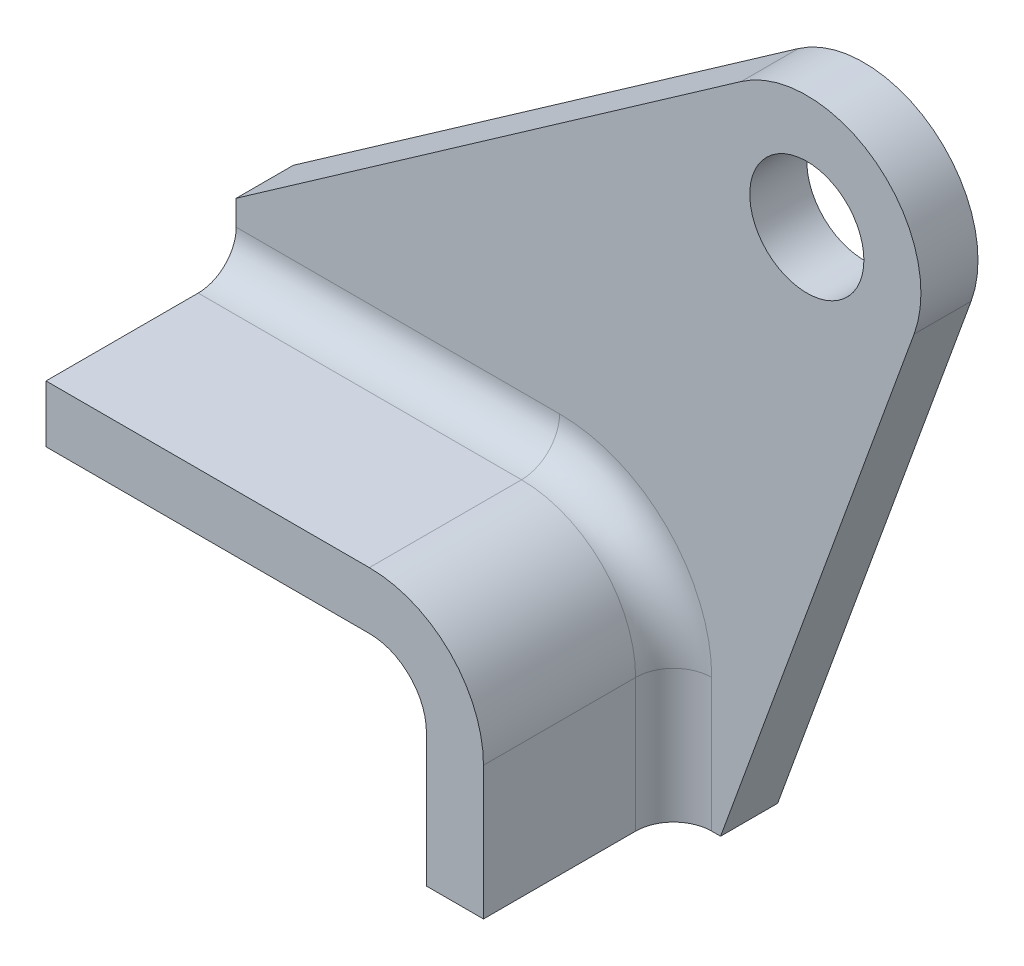
ISO-10303-21;
HEADER;
FILE_DESCRIPTION(('STEP AP214'),'2;1');
FILE_NAME('part.step','',(''),(''),'','','');
FILE_SCHEMA(('AUTOMOTIVE_DESIGN { 1 0 10303 214 1 1 1 1 }'));
ENDSEC;
DATA;
#1=APPLICATION_CONTEXT('core data for automotive mechanical design processes');
#2=APPLICATION_PROTOCOL_DEFINITION('international standard','automotive_design',2000,#1);
#3=PRODUCT_CONTEXT('',#1,'mechanical');
#4=PRODUCT('Part','Part','',(#3));
#5=PRODUCT_RELATED_PRODUCT_CATEGORY('part','',(#4));
#6=PRODUCT_DEFINITION_FORMATION('','',#4);
#7=PRODUCT_DEFINITION_CONTEXT('part definition',#1,'design');
#8=PRODUCT_DEFINITION('design','',#6,#7);
#9=PRODUCT_DEFINITION_SHAPE('','',#8);
#10=(LENGTH_UNIT() NAMED_UNIT(*) SI_UNIT(.MILLI.,.METRE.));
#11=(NAMED_UNIT(*) PLANE_ANGLE_UNIT() SI_UNIT($,.RADIAN.));
#12=(NAMED_UNIT(*) SI_UNIT($,.STERADIAN.) SOLID_ANGLE_UNIT());
#13=UNCERTAINTY_MEASURE_WITH_UNIT(LENGTH_MEASURE(1.E-05),#10,'distance_accuracy_value','');
#14=(GEOMETRIC_REPRESENTATION_CONTEXT(3) GLOBAL_UNCERTAINTY_ASSIGNED_CONTEXT((#13)) GLOBAL_UNIT_ASSIGNED_CONTEXT((#10,
#11,#12)) REPRESENTATION_CONTEXT('',''));
#15=CARTESIAN_POINT('',(0.,0.,0.));
#16=DIRECTION('',(0.,0.,1.));
#17=DIRECTION('',(1.,0.,0.));
#18=AXIS2_PLACEMENT_3D('',#15,#16,#17);
#19=CARTESIAN_POINT('',(-6.,-6.,6.));
#20=DIRECTION('',(0.,0.,-1.));
#21=DIRECTION('',(-1.,0.,0.));
#22=AXIS2_PLACEMENT_3D('',#19,#20,#21);
#23=PLANE('',#22);
#24=CARTESIAN_POINT('',(20.,40.,6.));
#25=DIRECTION('',(0.,0.,1.));
#26=DIRECTION('',(1.,0.,0.));
#27=AXIS2_PLACEMENT_3D('',#24,#25,#26);
#28=CIRCLE('',#27,5.99999999999999);
#29=CARTESIAN_POINT('',(26.,40.,6.));
#30=VERTEX_POINT('',#29);
#31=EDGE_CURVE('E188',#30,#30,#28,.T.);
#32=ORIENTED_EDGE('',*,*,#31,.F.);
#33=EDGE_LOOP('',(#32));
#34=FACE_BOUND('',#33,.T.);
#35=CARTESIAN_POINT('',(-6.,-6.,6.));
#36=DIRECTION('',(0.,0.,-1.));
#37=DIRECTION('',(-1.,0.,0.));
#38=AXIS2_PLACEMENT_3D('',#35,#36,#37);
#39=CIRCLE('',#38,16.);
#40=CARTESIAN_POINT('',(-6.00000000000006,10.,6.));
#41=VERTEX_POINT('',#40);
#42=CARTESIAN_POINT('',(10.,-6.00000000000008,6.));
#43=VERTEX_POINT('',#42);
#44=EDGE_CURVE('E241',#41,#43,#39,.T.);
#45=ORIENTED_EDGE('',*,*,#44,.T.);
#46=DIRECTION('',(0.,1.,0.));
#47=VECTOR('',#46,1.);
#48=CARTESIAN_POINT('',(10.,-20.,6.));
#49=LINE('',#48,#47);
#50=CARTESIAN_POINT('',(10.,-20.,6.));
#51=VERTEX_POINT('',#50);
#52=EDGE_CURVE('E243',#43,#51,#49,.F.);
#53=ORIENTED_EDGE('',*,*,#52,.T.);
#54=DIRECTION('',(1.,0.,0.));
#55=VECTOR('',#54,1.);
#56=CARTESIAN_POINT('',(0.,-20.,6.));
#57=LINE('',#56,#55);
#58=CARTESIAN_POINT('',(10.9319192137381,-20.,6.));
#59=VERTEX_POINT('',#58);
#60=EDGE_CURVE('E196',#51,#59,#57,.T.);
#61=ORIENTED_EDGE('',*,*,#60,.T.);
#62=DIRECTION('',(0.342020143325679,0.939692620785905,0.));
#63=VECTOR('',#62,1.);
#64=CARTESIAN_POINT('',(10.9319192137381,-20.,6.));
#65=LINE('',#64,#63);
#66=CARTESIAN_POINT('',(31.2763114494309,35.8957582800919,6.));
#67=VERTEX_POINT('',#66);
#68=EDGE_CURVE('E199',#59,#67,#65,.T.);
#69=ORIENTED_EDGE('',*,*,#68,.T.);
#70=CARTESIAN_POINT('',(20.,40.,6.));
#71=DIRECTION('',(0.,0.,1.));
#72=DIRECTION('',(1.,0.,0.));
#73=AXIS2_PLACEMENT_3D('',#70,#71,#72);
#74=CIRCLE('',#73,12.);
#75=CARTESIAN_POINT('',(13.1170827637875,49.8298245314679,6.));
#76=VERTEX_POINT('',#75);
#77=EDGE_CURVE('E201',#67,#76,#74,.T.);
#78=ORIENTED_EDGE('',*,*,#77,.T.);
#79=DIRECTION('',(-0.819152044288995,-0.573576436351042,0.));
#80=VECTOR('',#79,1.);
#81=CARTESIAN_POINT('',(13.1170827637875,49.8298245314679,6.));
#82=LINE('',#81,#80);
#83=CARTESIAN_POINT('',(-40.,12.6368427725553,6.));
#84=VERTEX_POINT('',#83);
#85=EDGE_CURVE('E203',#76,#84,#82,.T.);
#86=ORIENTED_EDGE('',*,*,#85,.T.);
#87=DIRECTION('',(0.,-1.,0.));
#88=VECTOR('',#87,1.);
#89=CARTESIAN_POINT('',(-40.,12.6368427725553,6.));
#90=LINE('',#89,#88);
#91=CARTESIAN_POINT('',(-40.,10.,6.));
#92=VERTEX_POINT('',#91);
#93=EDGE_CURVE('E193',#84,#92,#90,.T.);
#94=ORIENTED_EDGE('',*,*,#93,.T.);
#95=DIRECTION('',(-1.,0.,0.));
#96=VECTOR('',#95,1.);
#97=CARTESIAN_POINT('',(-6.00000000000004,10.,6.));
#98=LINE('',#97,#96);
#99=EDGE_CURVE('E239',#92,#41,#98,.F.);
#100=ORIENTED_EDGE('',*,*,#99,.T.);
#101=EDGE_LOOP('',(#45,#53,#61,#69,#78,#86,#94,#100));
#102=FACE_BOUND('',#101,.T.);
#103=ADVANCED_FACE('F33',(#34,#102),#23,.F.);
#104=CARTESIAN_POINT('',(-6.,-6.,0.));
#105=DIRECTION('',(0.,0.,-1.));
#106=DIRECTION('',(-1.,0.,0.));
#107=AXIS2_PLACEMENT_3D('',#104,#105,#106);
#108=PLANE('',#107);
#109=DIRECTION('',(0.,-1.,0.));
#110=VECTOR('',#109,1.);
#111=CARTESIAN_POINT('',(-40.,12.6368427725553,0.));
#112=LINE('',#111,#110);
#113=CARTESIAN_POINT('',(-40.,12.6368427725553,0.));
#114=VERTEX_POINT('',#113);
#115=CARTESIAN_POINT('',(-40.,0.,0.));
#116=VERTEX_POINT('',#115);
#117=EDGE_CURVE('E146',#114,#116,#112,.T.);
#118=ORIENTED_EDGE('',*,*,#117,.F.);
#119=DIRECTION('',(-0.819152044288995,-0.573576436351042,0.));
#120=VECTOR('',#119,1.);
#121=CARTESIAN_POINT('',(13.1170827637875,49.8298245314679,0.));
#122=LINE('',#121,#120);
#123=CARTESIAN_POINT('',(13.1170827637875,49.8298245314679,0.));
#124=VERTEX_POINT('',#123);
#125=EDGE_CURVE('E197',#124,#114,#122,.T.);
#126=ORIENTED_EDGE('',*,*,#125,.F.);
#127=CARTESIAN_POINT('',(20.,40.,0.));
#128=DIRECTION('',(0.,0.,1.));
#129=DIRECTION('',(1.,0.,0.));
#130=AXIS2_PLACEMENT_3D('',#127,#128,#129);
#131=CIRCLE('',#130,12.);
#132=CARTESIAN_POINT('',(31.2763114494309,35.8957582800919,0.));
#133=VERTEX_POINT('',#132);
#134=EDGE_CURVE('E217',#133,#124,#131,.T.);
#135=ORIENTED_EDGE('',*,*,#134,.F.);
#136=DIRECTION('',(0.342020143325679,0.939692620785905,0.));
#137=VECTOR('',#136,1.);
#138=CARTESIAN_POINT('',(10.9319192137381,-20.,0.));
#139=LINE('',#138,#137);
#140=CARTESIAN_POINT('',(10.9319192137381,-20.,0.));
#141=VERTEX_POINT('',#140);
#142=EDGE_CURVE('E215',#141,#133,#139,.T.);
#143=ORIENTED_EDGE('',*,*,#142,.F.);
#144=DIRECTION('',(1.,0.,0.));
#145=VECTOR('',#144,1.);
#146=CARTESIAN_POINT('',(0.,-20.,0.));
#147=LINE('',#146,#145);
#148=CARTESIAN_POINT('',(0.,-20.,0.));
#149=VERTEX_POINT('',#148);
#150=EDGE_CURVE('E213',#149,#141,#147,.T.);
#151=ORIENTED_EDGE('',*,*,#150,.F.);
#152=DIRECTION('',(0.,-1.,0.));
#153=VECTOR('',#152,1.);
#154=CARTESIAN_POINT('',(0.,-6.00000000000004,0.));
#155=LINE('',#154,#153);
#156=CARTESIAN_POINT('',(0.,-6.00000000000004,0.));
#157=VERTEX_POINT('',#156);
#158=EDGE_CURVE('E211',#157,#149,#155,.T.);
#159=ORIENTED_EDGE('',*,*,#158,.F.);
#160=CARTESIAN_POINT('',(-6.,-6.,0.));
#161=DIRECTION('',(0.,0.,-1.));
#162=DIRECTION('',(-1.,0.,0.));
#163=AXIS2_PLACEMENT_3D('',#160,#161,#162);
#164=CIRCLE('',#163,6.);
#165=CARTESIAN_POINT('',(-6.00000000000004,0.,0.));
#166=VERTEX_POINT('',#165);
#167=EDGE_CURVE('E209',#166,#157,#164,.T.);
#168=ORIENTED_EDGE('',*,*,#167,.F.);
#169=DIRECTION('',(1.,0.,0.));
#170=VECTOR('',#169,1.);
#171=CARTESIAN_POINT('',(-40.,0.,0.));
#172=LINE('',#171,#170);
#173=EDGE_CURVE('E207',#116,#166,#172,.T.);
#174=ORIENTED_EDGE('',*,*,#173,.F.);
#175=EDGE_LOOP('',(#118,#126,#135,#143,#151,#159,#168,#174));
#176=FACE_BOUND('',#175,.T.);
#177=CARTESIAN_POINT('',(20.,40.,0.));
#178=DIRECTION('',(0.,0.,1.));
#179=DIRECTION('',(1.,0.,0.));
#180=AXIS2_PLACEMENT_3D('',#177,#178,#179);
#181=CIRCLE('',#180,5.99999999999999);
#182=CARTESIAN_POINT('',(26.,40.,0.));
#183=VERTEX_POINT('',#182);
#184=EDGE_CURVE('E187',#183,#183,#181,.T.);
#185=ORIENTED_EDGE('',*,*,#184,.T.);
#186=EDGE_LOOP('',(#185));
#187=FACE_BOUND('',#186,.T.);
#188=ADVANCED_FACE('F287',(#176,#187),#108,.T.);
#189=CARTESIAN_POINT('',(-40.,12.6368427725553,6.));
#190=DIRECTION('',(1.,0.,0.));
#191=DIRECTION('',(0.,0.,-1.));
#192=AXIS2_PLACEMENT_3D('',#189,#190,#191);
#193=PLANE('',#192);
#194=ORIENTED_EDGE('',*,*,#117,.T.);
#195=DIRECTION('',(0.,0.,-1.));
#196=VECTOR('',#195,1.);
#197=CARTESIAN_POINT('',(-40.,0.,6.));
#198=LINE('',#197,#196);
#199=CARTESIAN_POINT('',(-40.,0.,26.));
#200=VERTEX_POINT('',#199);
#201=EDGE_CURVE('E139',#200,#116,#198,.T.);
#202=ORIENTED_EDGE('',*,*,#201,.F.);
#203=DIRECTION('',(0.,-1.,0.));
#204=VECTOR('',#203,1.);
#205=CARTESIAN_POINT('',(-40.,0.,26.));
#206=LINE('',#205,#204);
#207=CARTESIAN_POINT('',(-40.,6.,26.));
#208=VERTEX_POINT('',#207);
#209=EDGE_CURVE('E143',#208,#200,#206,.T.);
#210=ORIENTED_EDGE('',*,*,#209,.F.);
#211=DIRECTION('',(0.,0.,-1.));
#212=VECTOR('',#211,1.);
#213=CARTESIAN_POINT('',(-40.,6.,26.));
#214=LINE('',#213,#212);
#215=CARTESIAN_POINT('',(-40.,6.,10.));
#216=VERTEX_POINT('',#215);
#217=EDGE_CURVE('E178',#208,#216,#214,.T.);
#218=ORIENTED_EDGE('',*,*,#217,.T.);
#219=CARTESIAN_POINT('',(-40.,10.,10.));
#220=DIRECTION('',(1.,0.,0.));
#221=DIRECTION('',(0.,0.,-1.));
#222=AXIS2_PLACEMENT_3D('',#219,#220,#221);
#223=CIRCLE('',#222,4.);
#224=EDGE_CURVE('E11',#216,#92,#223,.T.);
#225=ORIENTED_EDGE('',*,*,#224,.T.);
#226=ORIENTED_EDGE('',*,*,#93,.F.);
#227=DIRECTION('',(0.,0.,-1.));
#228=VECTOR('',#227,1.);
#229=CARTESIAN_POINT('',(-40.,12.6368427725553,6.));
#230=LINE('',#229,#228);
#231=EDGE_CURVE('E205',#84,#114,#230,.T.);
#232=ORIENTED_EDGE('',*,*,#231,.T.);
#233=EDGE_LOOP('',(#194,#202,#210,#218,#225,#226,#232));
#234=FACE_BOUND('',#233,.T.);
#235=ADVANCED_FACE('F141',(#234),#193,.F.);
#236=CARTESIAN_POINT('',(-40.,0.,6.));
#237=DIRECTION('',(0.,1.,0.));
#238=DIRECTION('',(0.,0.,1.));
#239=AXIS2_PLACEMENT_3D('',#236,#237,#238);
#240=PLANE('',#239);
#241=ORIENTED_EDGE('',*,*,#173,.T.);
#242=DIRECTION('',(0.,0.,-1.));
#243=VECTOR('',#242,1.);
#244=CARTESIAN_POINT('',(-6.00000000000004,0.,6.));
#245=LINE('',#244,#243);
#246=CARTESIAN_POINT('',(-6.00000000000004,0.,26.));
#247=VERTEX_POINT('',#246);
#248=EDGE_CURVE('E149',#247,#166,#245,.T.);
#249=ORIENTED_EDGE('',*,*,#248,.F.);
#250=DIRECTION('',(1.,0.,0.));
#251=VECTOR('',#250,1.);
#252=CARTESIAN_POINT('',(-40.,0.,26.));
#253=LINE('',#252,#251);
#254=EDGE_CURVE('E152',#200,#247,#253,.T.);
#255=ORIENTED_EDGE('',*,*,#254,.F.);
#256=ORIENTED_EDGE('',*,*,#201,.T.);
#257=EDGE_LOOP('',(#241,#249,#255,#256));
#258=FACE_BOUND('',#257,.T.);
#259=ADVANCED_FACE('F153',(#258),#240,.F.);
#260=CARTESIAN_POINT('',(-6.,-6.,6.));
#261=DIRECTION('',(0.,0.,-1.));
#262=DIRECTION('',(-1.,0.,0.));
#263=AXIS2_PLACEMENT_3D('',#260,#261,#262);
#264=CYLINDRICAL_SURFACE('',#263,6.);
#265=ORIENTED_EDGE('',*,*,#167,.T.);
#266=DIRECTION('',(0.,0.,-1.));
#267=VECTOR('',#266,1.);
#268=CARTESIAN_POINT('',(0.,-6.00000000000004,6.));
#269=LINE('',#268,#267);
#270=CARTESIAN_POINT('',(0.,-6.00000000000004,26.));
#271=VERTEX_POINT('',#270);
#272=EDGE_CURVE('E233',#271,#157,#269,.T.);
#273=ORIENTED_EDGE('',*,*,#272,.F.);
#274=CARTESIAN_POINT('',(-6.,-6.,26.));
#275=DIRECTION('',(0.,0.,-1.));
#276=DIRECTION('',(1.,0.,0.));
#277=AXIS2_PLACEMENT_3D('',#274,#275,#276);
#278=CIRCLE('',#277,6.);
#279=EDGE_CURVE('E158',#247,#271,#278,.T.);
#280=ORIENTED_EDGE('',*,*,#279,.F.);
#281=ORIENTED_EDGE('',*,*,#248,.T.);
#282=EDGE_LOOP('',(#265,#273,#280,#281));
#283=FACE_BOUND('',#282,.T.);
#284=ADVANCED_FACE('F317',(#283),#264,.F.);
#285=CARTESIAN_POINT('',(0.,-6.00000000000004,6.));
#286=DIRECTION('',(1.,0.,0.));
#287=DIRECTION('',(0.,1.,0.));
#288=AXIS2_PLACEMENT_3D('',#285,#286,#287);
#289=PLANE('',#288);
#290=ORIENTED_EDGE('',*,*,#158,.T.);
#291=DIRECTION('',(0.,0.,-1.));
#292=VECTOR('',#291,1.);
#293=CARTESIAN_POINT('',(0.,-20.,6.));
#294=LINE('',#293,#292);
#295=CARTESIAN_POINT('',(0.,-20.,26.));
#296=VERTEX_POINT('',#295);
#297=EDGE_CURVE('E230',#296,#149,#294,.T.);
#298=ORIENTED_EDGE('',*,*,#297,.F.);
#299=DIRECTION('',(0.,-1.,0.));
#300=VECTOR('',#299,1.);
#301=CARTESIAN_POINT('',(0.,-6.00000000000004,26.));
#302=LINE('',#301,#300);
#303=EDGE_CURVE('E168',#271,#296,#302,.T.);
#304=ORIENTED_EDGE('',*,*,#303,.F.);
#305=ORIENTED_EDGE('',*,*,#272,.T.);
#306=EDGE_LOOP('',(#290,#298,#304,#305));
#307=FACE_BOUND('',#306,.T.);
#308=ADVANCED_FACE('F314',(#307),#289,.F.);
#309=CARTESIAN_POINT('',(0.,-20.,6.));
#310=DIRECTION('',(0.,1.,0.));
#311=DIRECTION('',(-1.,0.,0.));
#312=AXIS2_PLACEMENT_3D('',#309,#310,#311);
#313=PLANE('',#312);
#314=ORIENTED_EDGE('',*,*,#150,.T.);
#315=DIRECTION('',(0.,0.,-1.));
#316=VECTOR('',#315,1.);
#317=CARTESIAN_POINT('',(10.9319192137381,-20.,6.));
#318=LINE('',#317,#316);
#319=EDGE_CURVE('E227',#59,#141,#318,.T.);
#320=ORIENTED_EDGE('',*,*,#319,.F.);
#321=ORIENTED_EDGE('',*,*,#60,.F.);
#322=CARTESIAN_POINT('',(10.,-20.,10.));
#323=DIRECTION('',(0.,1.,0.));
#324=DIRECTION('',(-1.,0.,0.));
#325=AXIS2_PLACEMENT_3D('',#322,#323,#324);
#326=CIRCLE('',#325,4.);
#327=CARTESIAN_POINT('',(6.,-20.,10.));
#328=VERTEX_POINT('',#327);
#329=EDGE_CURVE('E42',#51,#328,#326,.T.);
#330=ORIENTED_EDGE('',*,*,#329,.T.);
#331=DIRECTION('',(0.,0.,-1.));
#332=VECTOR('',#331,1.);
#333=CARTESIAN_POINT('',(6.,-20.,26.));
#334=LINE('',#333,#332);
#335=CARTESIAN_POINT('',(6.,-20.,26.));
#336=VERTEX_POINT('',#335);
#337=EDGE_CURVE('E184',#336,#328,#334,.T.);
#338=ORIENTED_EDGE('',*,*,#337,.F.);
#339=DIRECTION('',(1.,0.,0.));
#340=VECTOR('',#339,1.);
#341=CARTESIAN_POINT('',(0.,-20.,26.));
#342=LINE('',#341,#340);
#343=EDGE_CURVE('E171',#296,#336,#342,.T.);
#344=ORIENTED_EDGE('',*,*,#343,.F.);
#345=ORIENTED_EDGE('',*,*,#297,.T.);
#346=EDGE_LOOP('',(#314,#320,#321,#330,#338,#344,#345));
#347=FACE_BOUND('',#346,.T.);
#348=ADVANCED_FACE('F267',(#347),#313,.F.);
#349=CARTESIAN_POINT('',(10.9319192137381,-20.,6.));
#350=DIRECTION('',(-0.939692620785904,0.342020143325679,0.));
#351=DIRECTION('',(-0.342020143325679,-0.939692620785905,0.));
#352=AXIS2_PLACEMENT_3D('',#349,#350,#351);
#353=PLANE('',#352);
#354=ORIENTED_EDGE('',*,*,#142,.T.);
#355=DIRECTION('',(0.,0.,-1.));
#356=VECTOR('',#355,1.);
#357=CARTESIAN_POINT('',(31.2763114494309,35.8957582800919,6.));
#358=LINE('',#357,#356);
#359=EDGE_CURVE('E224',#67,#133,#358,.T.);
#360=ORIENTED_EDGE('',*,*,#359,.F.);
#361=ORIENTED_EDGE('',*,*,#68,.F.);
#362=ORIENTED_EDGE('',*,*,#319,.T.);
#363=EDGE_LOOP('',(#354,#360,#361,#362));
#364=FACE_BOUND('',#363,.T.);
#365=ADVANCED_FACE('F307',(#364),#353,.F.);
#366=CARTESIAN_POINT('',(20.,40.,6.));
#367=DIRECTION('',(0.,0.,-1.));
#368=DIRECTION('',(-1.,0.,0.));
#369=AXIS2_PLACEMENT_3D('',#366,#367,#368);
#370=CYLINDRICAL_SURFACE('',#369,12.);
#371=ORIENTED_EDGE('',*,*,#134,.T.);
#372=DIRECTION('',(0.,0.,-1.));
#373=VECTOR('',#372,1.);
#374=CARTESIAN_POINT('',(13.1170827637875,49.8298245314679,6.));
#375=LINE('',#374,#373);
#376=EDGE_CURVE('E221',#76,#124,#375,.T.);
#377=ORIENTED_EDGE('',*,*,#376,.F.);
#378=ORIENTED_EDGE('',*,*,#77,.F.);
#379=ORIENTED_EDGE('',*,*,#359,.T.);
#380=EDGE_LOOP('',(#371,#377,#378,#379));
#381=FACE_BOUND('',#380,.T.);
#382=ADVANCED_FACE('F303',(#381),#370,.T.);
#383=CARTESIAN_POINT('',(13.1170827637875,49.8298245314679,6.));
#384=DIRECTION('',(0.573576436351042,-0.819152044288995,0.));
#385=DIRECTION('',(0.819152044288995,0.573576436351042,0.));
#386=AXIS2_PLACEMENT_3D('',#383,#384,#385);
#387=PLANE('',#386);
#388=ORIENTED_EDGE('',*,*,#125,.T.);
#389=ORIENTED_EDGE('',*,*,#231,.F.);
#390=ORIENTED_EDGE('',*,*,#85,.F.);
#391=ORIENTED_EDGE('',*,*,#376,.T.);
#392=EDGE_LOOP('',(#388,#389,#390,#391));
#393=FACE_BOUND('',#392,.T.);
#394=ADVANCED_FACE('F300',(#393),#387,.F.);
#395=CARTESIAN_POINT('',(20.,40.,6.));
#396=DIRECTION('',(0.,0.,-1.));
#397=DIRECTION('',(-1.,0.,0.));
#398=AXIS2_PLACEMENT_3D('',#395,#396,#397);
#399=CYLINDRICAL_SURFACE('',#398,5.99999999999999);
#400=ORIENTED_EDGE('',*,*,#31,.T.);
#401=EDGE_LOOP('',(#400));
#402=FACE_BOUND('',#401,.T.);
#403=ORIENTED_EDGE('',*,*,#184,.F.);
#404=EDGE_LOOP('',(#403));
#405=FACE_BOUND('',#404,.T.);
#406=ADVANCED_FACE('F297',(#402,#405),#399,.F.);
#407=CARTESIAN_POINT('',(6.,-6.00000000000008,26.));
#408=DIRECTION('',(-1.,0.,0.));
#409=DIRECTION('',(0.,-1.,0.));
#410=AXIS2_PLACEMENT_3D('',#407,#408,#409);
#411=PLANE('',#410);
#412=ORIENTED_EDGE('',*,*,#337,.T.);
#413=DIRECTION('',(0.,1.,0.));
#414=VECTOR('',#413,1.);
#415=CARTESIAN_POINT('',(6.,-6.00000000000008,10.));
#416=LINE('',#415,#414);
#417=CARTESIAN_POINT('',(6.,-6.00000000000008,10.));
#418=VERTEX_POINT('',#417);
#419=EDGE_CURVE('E148',#328,#418,#416,.T.);
#420=ORIENTED_EDGE('',*,*,#419,.T.);
#421=DIRECTION('',(0.,0.,-1.));
#422=VECTOR('',#421,1.);
#423=CARTESIAN_POINT('',(6.,-6.00000000000008,26.));
#424=LINE('',#423,#422);
#425=CARTESIAN_POINT('',(6.,-6.00000000000008,26.));
#426=VERTEX_POINT('',#425);
#427=EDGE_CURVE('E182',#426,#418,#424,.T.);
#428=ORIENTED_EDGE('',*,*,#427,.F.);
#429=DIRECTION('',(0.,1.,0.));
#430=VECTOR('',#429,1.);
#431=CARTESIAN_POINT('',(6.,-6.00000000000008,26.));
#432=LINE('',#431,#430);
#433=EDGE_CURVE('E173',#336,#426,#432,.T.);
#434=ORIENTED_EDGE('',*,*,#433,.F.);
#435=EDGE_LOOP('',(#412,#420,#428,#434));
#436=FACE_BOUND('',#435,.T.);
#437=ADVANCED_FACE('F259',(#436),#411,.F.);
#438=CARTESIAN_POINT('',(-6.,-6.,26.));
#439=DIRECTION('',(0.,0.,-1.));
#440=DIRECTION('',(-1.,0.,0.));
#441=AXIS2_PLACEMENT_3D('',#438,#439,#440);
#442=CYLINDRICAL_SURFACE('',#441,12.);
#443=ORIENTED_EDGE('',*,*,#427,.T.);
#444=CARTESIAN_POINT('',(-6.,-6.,10.));
#445=DIRECTION('',(0.,0.,-1.));
#446=DIRECTION('',(-1.,0.,0.));
#447=AXIS2_PLACEMENT_3D('',#444,#445,#446);
#448=CIRCLE('',#447,12.);
#449=CARTESIAN_POINT('',(-6.00000000000004,6.,10.));
#450=VERTEX_POINT('',#449);
#451=EDGE_CURVE('E58',#418,#450,#448,.F.);
#452=ORIENTED_EDGE('',*,*,#451,.T.);
#453=DIRECTION('',(0.,0.,-1.));
#454=VECTOR('',#453,1.);
#455=CARTESIAN_POINT('',(-6.00000000000004,6.,26.));
#456=LINE('',#455,#454);
#457=CARTESIAN_POINT('',(-6.00000000000004,6.,26.));
#458=VERTEX_POINT('',#457);
#459=EDGE_CURVE('E180',#458,#450,#456,.T.);
#460=ORIENTED_EDGE('',*,*,#459,.F.);
#461=CARTESIAN_POINT('',(-6.,-6.,26.));
#462=DIRECTION('',(0.,0.,1.));
#463=DIRECTION('',(1.,0.,0.));
#464=AXIS2_PLACEMENT_3D('',#461,#462,#463);
#465=CIRCLE('',#464,12.);
#466=EDGE_CURVE('E175',#426,#458,#465,.T.);
#467=ORIENTED_EDGE('',*,*,#466,.F.);
#468=EDGE_LOOP('',(#443,#452,#460,#467));
#469=FACE_BOUND('',#468,.T.);
#470=ADVANCED_FACE('F263',(#469),#442,.T.);
#471=CARTESIAN_POINT('',(-40.,6.,26.));
#472=DIRECTION('',(0.,-1.,0.));
#473=DIRECTION('',(0.,0.,-1.));
#474=AXIS2_PLACEMENT_3D('',#471,#472,#473);
#475=PLANE('',#474);
#476=ORIENTED_EDGE('',*,*,#459,.T.);
#477=DIRECTION('',(-1.,0.,0.));
#478=VECTOR('',#477,1.);
#479=CARTESIAN_POINT('',(-40.,6.,10.));
#480=LINE('',#479,#478);
#481=EDGE_CURVE('E50',#450,#216,#480,.T.);
#482=ORIENTED_EDGE('',*,*,#481,.T.);
#483=ORIENTED_EDGE('',*,*,#217,.F.);
#484=DIRECTION('',(-1.,0.,0.));
#485=VECTOR('',#484,1.);
#486=CARTESIAN_POINT('',(-40.,6.,26.));
#487=LINE('',#486,#485);
#488=EDGE_CURVE('E162',#458,#208,#487,.T.);
#489=ORIENTED_EDGE('',*,*,#488,.F.);
#490=EDGE_LOOP('',(#476,#482,#483,#489));
#491=FACE_BOUND('',#490,.T.);
#492=ADVANCED_FACE('F277',(#491),#475,.F.);
#493=CARTESIAN_POINT('',(-6.,-6.,26.));
#494=DIRECTION('',(0.,0.,1.));
#495=DIRECTION('',(1.,0.,0.));
#496=AXIS2_PLACEMENT_3D('',#493,#494,#495);
#497=PLANE('',#496);
#498=ORIENTED_EDGE('',*,*,#209,.T.);
#499=ORIENTED_EDGE('',*,*,#254,.T.);
#500=ORIENTED_EDGE('',*,*,#279,.T.);
#501=ORIENTED_EDGE('',*,*,#303,.T.);
#502=ORIENTED_EDGE('',*,*,#343,.T.);
#503=ORIENTED_EDGE('',*,*,#433,.T.);
#504=ORIENTED_EDGE('',*,*,#466,.T.);
#505=ORIENTED_EDGE('',*,*,#488,.T.);
#506=EDGE_LOOP('',(#498,#499,#500,#501,#502,#503,#504,#505));
#507=FACE_BOUND('',#506,.T.);
#508=ADVANCED_FACE('F160',(#507),#497,.T.);
#509=CARTESIAN_POINT('',(-40.,10.,10.));
#510=DIRECTION('',(1.,0.,0.));
#511=DIRECTION('',(0.,0.,-1.));
#512=AXIS2_PLACEMENT_3D('',#509,#510,#511);
#513=CYLINDRICAL_SURFACE('',#512,4.);
#514=ORIENTED_EDGE('',*,*,#224,.F.);
#515=ORIENTED_EDGE('',*,*,#481,.F.);
#516=CARTESIAN_POINT('',(-6.00000000000006,10.,10.));
#517=DIRECTION('',(-1.,0.,0.));
#518=DIRECTION('',(0.,-1.,0.));
#519=AXIS2_PLACEMENT_3D('',#516,#517,#518);
#520=CIRCLE('',#519,4.);
#521=EDGE_CURVE('E37',#41,#450,#520,.T.);
#522=ORIENTED_EDGE('',*,*,#521,.F.);
#523=ORIENTED_EDGE('',*,*,#99,.F.);
#524=EDGE_LOOP('',(#514,#515,#522,#523));
#525=FACE_BOUND('',#524,.T.);
#526=ADVANCED_FACE('F35',(#525),#513,.F.);
#527=CARTESIAN_POINT('',(-6.,-6.,10.));
#528=DIRECTION('',(0.,0.,-1.));
#529=DIRECTION('',(-1.,0.,0.));
#530=AXIS2_PLACEMENT_3D('',#527,#528,#529);
#531=TOROIDAL_SURFACE('',#530,16.,4.);
#532=ORIENTED_EDGE('',*,*,#521,.T.);
#533=ORIENTED_EDGE('',*,*,#451,.F.);
#534=CARTESIAN_POINT('',(10.,-6.00000000000008,10.));
#535=DIRECTION('',(0.,1.,0.));
#536=DIRECTION('',(0.,0.,1.));
#537=AXIS2_PLACEMENT_3D('',#534,#535,#536);
#538=CIRCLE('',#537,4.);
#539=EDGE_CURVE('E165',#43,#418,#538,.T.);
#540=ORIENTED_EDGE('',*,*,#539,.F.);
#541=ORIENTED_EDGE('',*,*,#44,.F.);
#542=EDGE_LOOP('',(#532,#533,#540,#541));
#543=FACE_BOUND('',#542,.T.);
#544=ADVANCED_FACE('F255',(#543),#531,.F.);
#545=CARTESIAN_POINT('',(10.,-6.00000000000008,10.));
#546=DIRECTION('',(0.,-1.,0.));
#547=DIRECTION('',(1.,0.,0.));
#548=AXIS2_PLACEMENT_3D('',#545,#546,#547);
#549=CYLINDRICAL_SURFACE('',#548,4.);
#550=ORIENTED_EDGE('',*,*,#329,.F.);
#551=ORIENTED_EDGE('',*,*,#52,.F.);
#552=ORIENTED_EDGE('',*,*,#539,.T.);
#553=ORIENTED_EDGE('',*,*,#419,.F.);
#554=EDGE_LOOP('',(#550,#551,#552,#553));
#555=FACE_BOUND('',#554,.T.);
#556=ADVANCED_FACE('F252',(#555),#549,.F.);
#557=CLOSED_SHELL('',(#103,#188,#235,#259,#284,#308,#348,#365,#382,#394,#406,#437,#470,#492,
#508,#526,#544,#556));
#558=MANIFOLD_SOLID_BREP('B2',#557);
#559=ADVANCED_BREP_SHAPE_REPRESENTATION('',(#18,#558),#14);
#560=SHAPE_DEFINITION_REPRESENTATION(#9,#559);
ENDSEC;
END-ISO-10303-21;
